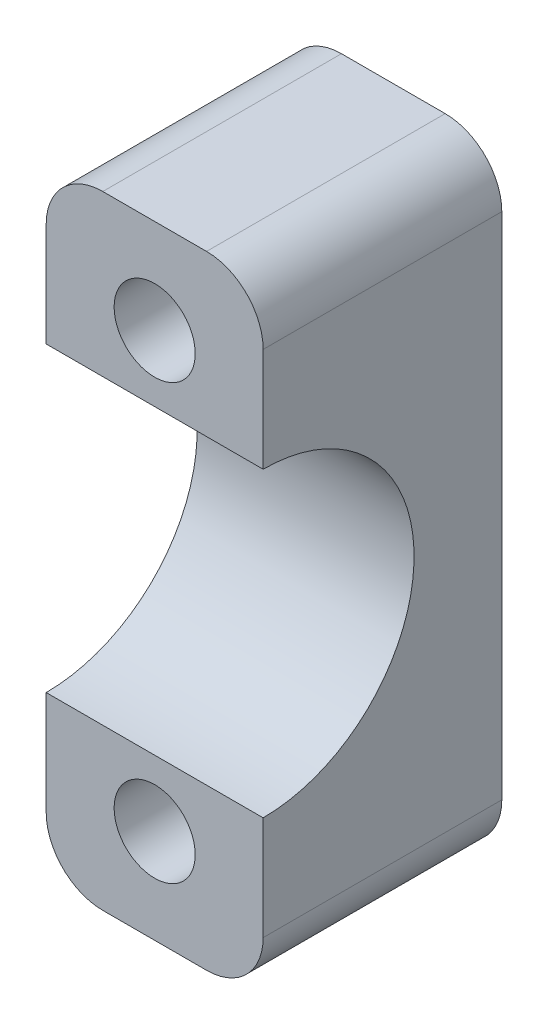
ISO-10303-21;
HEADER;
FILE_DESCRIPTION(('STEP AP214'),'2;1');
FILE_NAME('part.step','',(''),(''),'','','');
FILE_SCHEMA(('AUTOMOTIVE_DESIGN { 1 0 10303 214 1 1 1 1 }'));
ENDSEC;
DATA;
#1=APPLICATION_CONTEXT('core data for automotive mechanical design processes');
#2=APPLICATION_PROTOCOL_DEFINITION('international standard','automotive_design',2000,#1);
#3=PRODUCT_CONTEXT('',#1,'mechanical');
#4=PRODUCT('Part','Part','',(#3));
#5=PRODUCT_RELATED_PRODUCT_CATEGORY('part','',(#4));
#6=PRODUCT_DEFINITION_FORMATION('','',#4);
#7=PRODUCT_DEFINITION_CONTEXT('part definition',#1,'design');
#8=PRODUCT_DEFINITION('design','',#6,#7);
#9=PRODUCT_DEFINITION_SHAPE('','',#8);
#10=(LENGTH_UNIT() NAMED_UNIT(*) SI_UNIT(.MILLI.,.METRE.));
#11=(NAMED_UNIT(*) PLANE_ANGLE_UNIT() SI_UNIT($,.RADIAN.));
#12=(NAMED_UNIT(*) SI_UNIT($,.STERADIAN.) SOLID_ANGLE_UNIT());
#13=UNCERTAINTY_MEASURE_WITH_UNIT(LENGTH_MEASURE(1.E-05),#10,'distance_accuracy_value','');
#14=(GEOMETRIC_REPRESENTATION_CONTEXT(3) GLOBAL_UNCERTAINTY_ASSIGNED_CONTEXT((#13)) GLOBAL_UNIT_ASSIGNED_CONTEXT((#10,
#11,#12)) REPRESENTATION_CONTEXT('',''));
#15=CARTESIAN_POINT('',(0.,0.,0.));
#16=DIRECTION('',(0.,0.,1.));
#17=DIRECTION('',(1.,0.,0.));
#18=AXIS2_PLACEMENT_3D('',#15,#16,#17);
#19=CARTESIAN_POINT('',(0.,0.,12.65));
#20=DIRECTION('',(0.,0.,1.));
#21=DIRECTION('',(1.,0.,0.));
#22=AXIS2_PLACEMENT_3D('',#19,#20,#21);
#23=PLANE('',#22);
#24=CARTESIAN_POINT('',(0.,-11.5,12.65));
#25=DIRECTION('',(0.,0.,-1.));
#26=DIRECTION('',(-1.,0.,0.));
#27=AXIS2_PLACEMENT_3D('',#24,#25,#26);
#28=CIRCLE('',#27,2.15);
#29=CARTESIAN_POINT('',(-2.15,-11.5,12.65));
#30=VERTEX_POINT('',#29);
#31=EDGE_CURVE('E125',#30,#30,#28,.T.);
#32=ORIENTED_EDGE('',*,*,#31,.T.);
#33=EDGE_LOOP('',(#32));
#34=FACE_BOUND('',#33,.T.);
#35=DIRECTION('',(1.,0.,0.));
#36=VECTOR('',#35,1.);
#37=CARTESIAN_POINT('',(-5.751,-8.,12.65));
#38=LINE('',#37,#36);
#39=CARTESIAN_POINT('',(-5.75,-8.,12.65));
#40=VERTEX_POINT('',#39);
#41=CARTESIAN_POINT('',(5.75,-8.,12.65));
#42=VERTEX_POINT('',#41);
#43=EDGE_CURVE('E117',#40,#42,#38,.T.);
#44=ORIENTED_EDGE('',*,*,#43,.F.);
#45=DIRECTION('',(0.,-1.,0.));
#46=VECTOR('',#45,1.);
#47=CARTESIAN_POINT('',(-5.75,16.5,12.65));
#48=LINE('',#47,#46);
#49=CARTESIAN_POINT('',(-5.75,-13.5,12.65));
#50=VERTEX_POINT('',#49);
#51=EDGE_CURVE('E59',#40,#50,#48,.T.);
#52=ORIENTED_EDGE('',*,*,#51,.T.);
#53=CARTESIAN_POINT('',(-2.75,-13.5,12.65));
#54=DIRECTION('',(0.,0.,1.));
#55=DIRECTION('',(1.,0.,0.));
#56=AXIS2_PLACEMENT_3D('',#53,#54,#55);
#57=CIRCLE('',#56,3.);
#58=CARTESIAN_POINT('',(-2.75,-16.5,12.65));
#59=VERTEX_POINT('',#58);
#60=EDGE_CURVE('E174',#50,#59,#57,.T.);
#61=ORIENTED_EDGE('',*,*,#60,.T.);
#62=DIRECTION('',(1.,0.,0.));
#63=VECTOR('',#62,1.);
#64=CARTESIAN_POINT('',(-5.75,-16.5,12.65));
#65=LINE('',#64,#63);
#66=CARTESIAN_POINT('',(2.75,-16.5,12.65));
#67=VERTEX_POINT('',#66);
#68=EDGE_CURVE('E131',#59,#67,#65,.T.);
#69=ORIENTED_EDGE('',*,*,#68,.T.);
#70=CARTESIAN_POINT('',(2.75,-13.5,12.65));
#71=DIRECTION('',(0.,0.,1.));
#72=DIRECTION('',(1.,0.,0.));
#73=AXIS2_PLACEMENT_3D('',#70,#71,#72);
#74=CIRCLE('',#73,3.);
#75=CARTESIAN_POINT('',(5.75,-13.5,12.65));
#76=VERTEX_POINT('',#75);
#77=EDGE_CURVE('E176',#67,#76,#74,.T.);
#78=ORIENTED_EDGE('',*,*,#77,.T.);
#79=DIRECTION('',(0.,1.,0.));
#80=VECTOR('',#79,1.);
#81=CARTESIAN_POINT('',(5.75,16.5,12.65));
#82=LINE('',#81,#80);
#83=EDGE_CURVE('E212',#76,#42,#82,.T.);
#84=ORIENTED_EDGE('',*,*,#83,.T.);
#85=EDGE_LOOP('',(#44,#52,#61,#69,#78,#84));
#86=FACE_BOUND('',#85,.T.);
#87=ADVANCED_FACE('F36',(#34,#86),#23,.T.);
#88=CARTESIAN_POINT('',(5.75,16.5,12.65));
#89=DIRECTION('',(-1.,0.,0.));
#90=DIRECTION('',(0.,-1.,0.));
#91=AXIS2_PLACEMENT_3D('',#88,#89,#90);
#92=PLANE('',#91);
#93=CARTESIAN_POINT('',(5.75,8.,12.65));
#94=VERTEX_POINT('',#93);
#95=CARTESIAN_POINT('',(5.75,13.5,12.65));
#96=VERTEX_POINT('',#95);
#97=EDGE_CURVE('E152',#94,#96,#82,.T.);
#98=ORIENTED_EDGE('',*,*,#97,.F.);
#99=CARTESIAN_POINT('',(5.75,0.,12.65));
#100=DIRECTION('',(1.,0.,0.));
#101=DIRECTION('',(0.,1.,0.));
#102=AXIS2_PLACEMENT_3D('',#99,#100,#101);
#103=CIRCLE('',#102,8.);
#104=EDGE_CURVE('E51',#42,#94,#103,.T.);
#105=ORIENTED_EDGE('',*,*,#104,.F.);
#106=ORIENTED_EDGE('',*,*,#83,.F.);
#107=DIRECTION('',(0.,0.,-1.));
#108=VECTOR('',#107,1.);
#109=CARTESIAN_POINT('',(5.75,-13.5,12.65));
#110=LINE('',#109,#108);
#111=CARTESIAN_POINT('',(5.75,-13.5,0.));
#112=VERTEX_POINT('',#111);
#113=EDGE_CURVE('E155',#76,#112,#110,.T.);
#114=ORIENTED_EDGE('',*,*,#113,.T.);
#115=DIRECTION('',(0.,1.,0.));
#116=VECTOR('',#115,1.);
#117=CARTESIAN_POINT('',(5.75,16.5,0.));
#118=LINE('',#117,#116);
#119=CARTESIAN_POINT('',(5.75,13.5,0.));
#120=VERTEX_POINT('',#119);
#121=EDGE_CURVE('E140',#112,#120,#118,.T.);
#122=ORIENTED_EDGE('',*,*,#121,.T.);
#123=DIRECTION('',(0.,0.,-1.));
#124=VECTOR('',#123,1.);
#125=CARTESIAN_POINT('',(5.75,13.5,12.65));
#126=LINE('',#125,#124);
#127=EDGE_CURVE('E134',#120,#96,#126,.F.);
#128=ORIENTED_EDGE('',*,*,#127,.T.);
#129=EDGE_LOOP('',(#98,#105,#106,#114,#122,#128));
#130=FACE_BOUND('',#129,.T.);
#131=ADVANCED_FACE('F214',(#130),#92,.F.);
#132=CARTESIAN_POINT('',(-5.75,16.5,12.65));
#133=DIRECTION('',(0.,-1.,0.));
#134=DIRECTION('',(0.,0.,-1.));
#135=AXIS2_PLACEMENT_3D('',#132,#133,#134);
#136=PLANE('',#135);
#137=DIRECTION('',(-1.,0.,0.));
#138=VECTOR('',#137,1.);
#139=CARTESIAN_POINT('',(-5.75,16.5,0.));
#140=LINE('',#139,#138);
#141=CARTESIAN_POINT('',(2.75,16.5,0.));
#142=VERTEX_POINT('',#141);
#143=CARTESIAN_POINT('',(-2.75,16.5,0.));
#144=VERTEX_POINT('',#143);
#145=EDGE_CURVE('E143',#142,#144,#140,.T.);
#146=ORIENTED_EDGE('',*,*,#145,.T.);
#147=DIRECTION('',(0.,0.,-1.));
#148=VECTOR('',#147,1.);
#149=CARTESIAN_POINT('',(-2.75,16.5,12.65));
#150=LINE('',#149,#148);
#151=CARTESIAN_POINT('',(-2.75,16.5,12.65));
#152=VERTEX_POINT('',#151);
#153=EDGE_CURVE('E11',#144,#152,#150,.F.);
#154=ORIENTED_EDGE('',*,*,#153,.T.);
#155=DIRECTION('',(-1.,0.,0.));
#156=VECTOR('',#155,1.);
#157=CARTESIAN_POINT('',(-5.75,16.5,12.65));
#158=LINE('',#157,#156);
#159=CARTESIAN_POINT('',(2.75,16.5,12.65));
#160=VERTEX_POINT('',#159);
#161=EDGE_CURVE('E136',#160,#152,#158,.T.);
#162=ORIENTED_EDGE('',*,*,#161,.F.);
#163=DIRECTION('',(0.,0.,-1.));
#164=VECTOR('',#163,1.);
#165=CARTESIAN_POINT('',(2.75,16.5,12.65));
#166=LINE('',#165,#164);
#167=EDGE_CURVE('E44',#160,#142,#166,.T.);
#168=ORIENTED_EDGE('',*,*,#167,.T.);
#169=EDGE_LOOP('',(#146,#154,#162,#168));
#170=FACE_BOUND('',#169,.T.);
#171=ADVANCED_FACE('F186',(#170),#136,.F.);
#172=CARTESIAN_POINT('',(-5.75,16.5,12.65));
#173=DIRECTION('',(1.,0.,0.));
#174=DIRECTION('',(0.,1.,0.));
#175=AXIS2_PLACEMENT_3D('',#172,#173,#174);
#176=PLANE('',#175);
#177=ORIENTED_EDGE('',*,*,#51,.F.);
#178=CARTESIAN_POINT('',(-5.75,0.,12.65));
#179=DIRECTION('',(1.,0.,0.));
#180=DIRECTION('',(0.,1.,0.));
#181=AXIS2_PLACEMENT_3D('',#178,#179,#180);
#182=CIRCLE('',#181,8.);
#183=CARTESIAN_POINT('',(-5.75,8.,12.65));
#184=VERTEX_POINT('',#183);
#185=EDGE_CURVE('E113',#184,#40,#182,.F.);
#186=ORIENTED_EDGE('',*,*,#185,.F.);
#187=CARTESIAN_POINT('',(-5.75,13.5,12.65));
#188=VERTEX_POINT('',#187);
#189=EDGE_CURVE('E123',#188,#184,#48,.T.);
#190=ORIENTED_EDGE('',*,*,#189,.F.);
#191=DIRECTION('',(0.,0.,-1.));
#192=VECTOR('',#191,1.);
#193=CARTESIAN_POINT('',(-5.75,13.5,12.65));
#194=LINE('',#193,#192);
#195=CARTESIAN_POINT('',(-5.75,13.5,0.));
#196=VERTEX_POINT('',#195);
#197=EDGE_CURVE('E178',#188,#196,#194,.T.);
#198=ORIENTED_EDGE('',*,*,#197,.T.);
#199=DIRECTION('',(0.,-1.,0.));
#200=VECTOR('',#199,1.);
#201=CARTESIAN_POINT('',(-5.75,16.5,0.));
#202=LINE('',#201,#200);
#203=CARTESIAN_POINT('',(-5.75,-13.5,0.));
#204=VERTEX_POINT('',#203);
#205=EDGE_CURVE('E146',#196,#204,#202,.T.);
#206=ORIENTED_EDGE('',*,*,#205,.T.);
#207=DIRECTION('',(0.,0.,-1.));
#208=VECTOR('',#207,1.);
#209=CARTESIAN_POINT('',(-5.75,-13.5,12.65));
#210=LINE('',#209,#208);
#211=EDGE_CURVE('E180',#204,#50,#210,.F.);
#212=ORIENTED_EDGE('',*,*,#211,.T.);
#213=EDGE_LOOP('',(#177,#186,#190,#198,#206,#212));
#214=FACE_BOUND('',#213,.T.);
#215=ADVANCED_FACE('F121',(#214),#176,.F.);
#216=CARTESIAN_POINT('',(-5.75,-16.5,12.65));
#217=DIRECTION('',(0.,1.,0.));
#218=DIRECTION('',(0.,0.,1.));
#219=AXIS2_PLACEMENT_3D('',#216,#217,#218);
#220=PLANE('',#219);
#221=DIRECTION('',(1.,0.,0.));
#222=VECTOR('',#221,1.);
#223=CARTESIAN_POINT('',(-5.75,-16.5,0.));
#224=LINE('',#223,#222);
#225=CARTESIAN_POINT('',(-2.75,-16.5,0.));
#226=VERTEX_POINT('',#225);
#227=CARTESIAN_POINT('',(2.75,-16.5,0.));
#228=VERTEX_POINT('',#227);
#229=EDGE_CURVE('E149',#226,#228,#224,.T.);
#230=ORIENTED_EDGE('',*,*,#229,.T.);
#231=DIRECTION('',(0.,0.,-1.));
#232=VECTOR('',#231,1.);
#233=CARTESIAN_POINT('',(2.75,-16.5,12.65));
#234=LINE('',#233,#232);
#235=EDGE_CURVE('E169',#228,#67,#234,.F.);
#236=ORIENTED_EDGE('',*,*,#235,.T.);
#237=ORIENTED_EDGE('',*,*,#68,.F.);
#238=DIRECTION('',(0.,0.,-1.));
#239=VECTOR('',#238,1.);
#240=CARTESIAN_POINT('',(-2.75,-16.5,12.65));
#241=LINE('',#240,#239);
#242=EDGE_CURVE('E166',#59,#226,#241,.T.);
#243=ORIENTED_EDGE('',*,*,#242,.T.);
#244=EDGE_LOOP('',(#230,#236,#237,#243));
#245=FACE_BOUND('',#244,.T.);
#246=ADVANCED_FACE('F204',(#245),#220,.F.);
#247=CARTESIAN_POINT('',(0.,11.5,12.65));
#248=DIRECTION('',(0.,0.,-1.));
#249=DIRECTION('',(-1.,0.,0.));
#250=AXIS2_PLACEMENT_3D('',#247,#248,#249);
#251=CIRCLE('',#250,2.15);
#252=CARTESIAN_POINT('',(-2.15,11.5,12.65));
#253=VERTEX_POINT('',#252);
#254=EDGE_CURVE('E229',#253,#253,#251,.T.);
#255=ORIENTED_EDGE('',*,*,#254,.T.);
#256=EDGE_LOOP('',(#255));
#257=FACE_BOUND('',#256,.T.);
#258=DIRECTION('',(1.,0.,0.));
#259=VECTOR('',#258,1.);
#260=CARTESIAN_POINT('',(-5.751,8.,12.65));
#261=LINE('',#260,#259);
#262=EDGE_CURVE('E110',#184,#94,#261,.T.);
#263=ORIENTED_EDGE('',*,*,#262,.T.);
#264=ORIENTED_EDGE('',*,*,#97,.T.);
#265=CARTESIAN_POINT('',(2.75,13.5,12.65));
#266=DIRECTION('',(0.,0.,1.));
#267=DIRECTION('',(1.,0.,0.));
#268=AXIS2_PLACEMENT_3D('',#265,#266,#267);
#269=CIRCLE('',#268,3.);
#270=EDGE_CURVE('E171',#96,#160,#269,.T.);
#271=ORIENTED_EDGE('',*,*,#270,.T.);
#272=ORIENTED_EDGE('',*,*,#161,.T.);
#273=CARTESIAN_POINT('',(-2.75,13.5,12.65));
#274=DIRECTION('',(0.,0.,1.));
#275=DIRECTION('',(1.,0.,0.));
#276=AXIS2_PLACEMENT_3D('',#273,#274,#275);
#277=CIRCLE('',#276,3.);
#278=EDGE_CURVE('E130',#152,#188,#277,.T.);
#279=ORIENTED_EDGE('',*,*,#278,.T.);
#280=ORIENTED_EDGE('',*,*,#189,.T.);
#281=EDGE_LOOP('',(#263,#264,#271,#272,#279,#280));
#282=FACE_BOUND('',#281,.T.);
#283=ADVANCED_FACE('F127',(#257,#282),#23,.T.);
#284=CARTESIAN_POINT('',(0.,0.,0.));
#285=DIRECTION('',(0.,0.,1.));
#286=DIRECTION('',(1.,0.,0.));
#287=AXIS2_PLACEMENT_3D('',#284,#285,#286);
#288=PLANE('',#287);
#289=CARTESIAN_POINT('',(0.,11.5,0.));
#290=DIRECTION('',(0.,0.,-1.));
#291=DIRECTION('',(-1.,0.,0.));
#292=AXIS2_PLACEMENT_3D('',#289,#290,#291);
#293=CIRCLE('',#292,4.);
#294=CARTESIAN_POINT('',(-4.,11.5,0.));
#295=VERTEX_POINT('',#294);
#296=EDGE_CURVE('E238',#295,#295,#293,.T.);
#297=ORIENTED_EDGE('',*,*,#296,.F.);
#298=EDGE_LOOP('',(#297));
#299=FACE_BOUND('',#298,.T.);
#300=CARTESIAN_POINT('',(0.,-11.5,0.));
#301=DIRECTION('',(0.,0.,-1.));
#302=DIRECTION('',(-1.,0.,0.));
#303=AXIS2_PLACEMENT_3D('',#300,#301,#302);
#304=CIRCLE('',#303,4.);
#305=CARTESIAN_POINT('',(-4.,-11.5,0.));
#306=VERTEX_POINT('',#305);
#307=EDGE_CURVE('E226',#306,#306,#304,.T.);
#308=ORIENTED_EDGE('',*,*,#307,.F.);
#309=EDGE_LOOP('',(#308));
#310=FACE_BOUND('',#309,.T.);
#311=ORIENTED_EDGE('',*,*,#121,.F.);
#312=CARTESIAN_POINT('',(2.75,-13.5,0.));
#313=DIRECTION('',(0.,0.,1.));
#314=DIRECTION('',(1.,0.,0.));
#315=AXIS2_PLACEMENT_3D('',#312,#313,#314);
#316=CIRCLE('',#315,3.);
#317=EDGE_CURVE('E164',#112,#228,#316,.F.);
#318=ORIENTED_EDGE('',*,*,#317,.T.);
#319=ORIENTED_EDGE('',*,*,#229,.F.);
#320=CARTESIAN_POINT('',(-2.75,-13.5,0.));
#321=DIRECTION('',(0.,0.,1.));
#322=DIRECTION('',(1.,0.,0.));
#323=AXIS2_PLACEMENT_3D('',#320,#321,#322);
#324=CIRCLE('',#323,3.);
#325=EDGE_CURVE('E162',#226,#204,#324,.F.);
#326=ORIENTED_EDGE('',*,*,#325,.T.);
#327=ORIENTED_EDGE('',*,*,#205,.F.);
#328=CARTESIAN_POINT('',(-2.75,13.5,0.));
#329=DIRECTION('',(0.,0.,1.));
#330=DIRECTION('',(1.,0.,0.));
#331=AXIS2_PLACEMENT_3D('',#328,#329,#330);
#332=CIRCLE('',#331,3.);
#333=EDGE_CURVE('E160',#196,#144,#332,.F.);
#334=ORIENTED_EDGE('',*,*,#333,.T.);
#335=ORIENTED_EDGE('',*,*,#145,.F.);
#336=CARTESIAN_POINT('',(2.75,13.5,0.));
#337=DIRECTION('',(0.,0.,1.));
#338=DIRECTION('',(1.,0.,0.));
#339=AXIS2_PLACEMENT_3D('',#336,#337,#338);
#340=CIRCLE('',#339,3.);
#341=EDGE_CURVE('E158',#142,#120,#340,.F.);
#342=ORIENTED_EDGE('',*,*,#341,.T.);
#343=EDGE_LOOP('',(#311,#318,#319,#326,#327,#334,#335,#342));
#344=FACE_BOUND('',#343,.T.);
#345=ADVANCED_FACE('F192',(#299,#310,#344),#288,.F.);
#346=CARTESIAN_POINT('',(2.75,-13.5,12.65));
#347=DIRECTION('',(0.,0.,-1.));
#348=DIRECTION('',(-1.,0.,0.));
#349=AXIS2_PLACEMENT_3D('',#346,#347,#348);
#350=CYLINDRICAL_SURFACE('',#349,3.);
#351=ORIENTED_EDGE('',*,*,#77,.F.);
#352=ORIENTED_EDGE('',*,*,#235,.F.);
#353=ORIENTED_EDGE('',*,*,#317,.F.);
#354=ORIENTED_EDGE('',*,*,#113,.F.);
#355=EDGE_LOOP('',(#351,#352,#353,#354));
#356=FACE_BOUND('',#355,.T.);
#357=ADVANCED_FACE('F208',(#356),#350,.T.);
#358=CARTESIAN_POINT('',(-2.75,-13.5,12.65));
#359=DIRECTION('',(0.,0.,-1.));
#360=DIRECTION('',(-1.,0.,0.));
#361=AXIS2_PLACEMENT_3D('',#358,#359,#360);
#362=CYLINDRICAL_SURFACE('',#361,3.);
#363=ORIENTED_EDGE('',*,*,#60,.F.);
#364=ORIENTED_EDGE('',*,*,#211,.F.);
#365=ORIENTED_EDGE('',*,*,#325,.F.);
#366=ORIENTED_EDGE('',*,*,#242,.F.);
#367=EDGE_LOOP('',(#363,#364,#365,#366));
#368=FACE_BOUND('',#367,.T.);
#369=ADVANCED_FACE('F199',(#368),#362,.T.);
#370=CARTESIAN_POINT('',(-2.75,13.5,12.65));
#371=DIRECTION('',(0.,0.,-1.));
#372=DIRECTION('',(-1.,0.,0.));
#373=AXIS2_PLACEMENT_3D('',#370,#371,#372);
#374=CYLINDRICAL_SURFACE('',#373,3.);
#375=ORIENTED_EDGE('',*,*,#278,.F.);
#376=ORIENTED_EDGE('',*,*,#153,.F.);
#377=ORIENTED_EDGE('',*,*,#333,.F.);
#378=ORIENTED_EDGE('',*,*,#197,.F.);
#379=EDGE_LOOP('',(#375,#376,#377,#378));
#380=FACE_BOUND('',#379,.T.);
#381=ADVANCED_FACE('F195',(#380),#374,.T.);
#382=CARTESIAN_POINT('',(2.75,13.5,12.65));
#383=DIRECTION('',(0.,0.,-1.));
#384=DIRECTION('',(-1.,0.,0.));
#385=AXIS2_PLACEMENT_3D('',#382,#383,#384);
#386=CYLINDRICAL_SURFACE('',#385,3.);
#387=ORIENTED_EDGE('',*,*,#270,.F.);
#388=ORIENTED_EDGE('',*,*,#127,.F.);
#389=ORIENTED_EDGE('',*,*,#341,.F.);
#390=ORIENTED_EDGE('',*,*,#167,.F.);
#391=EDGE_LOOP('',(#387,#388,#389,#390));
#392=FACE_BOUND('',#391,.T.);
#393=ADVANCED_FACE('F38',(#392),#386,.T.);
#394=CARTESIAN_POINT('',(-5.751,0.,12.65));
#395=DIRECTION('',(1.,0.,0.));
#396=DIRECTION('',(0.,1.,0.));
#397=AXIS2_PLACEMENT_3D('',#394,#395,#396);
#398=CYLINDRICAL_SURFACE('',#397,8.);
#399=ORIENTED_EDGE('',*,*,#185,.T.);
#400=ORIENTED_EDGE('',*,*,#43,.T.);
#401=ORIENTED_EDGE('',*,*,#104,.T.);
#402=ORIENTED_EDGE('',*,*,#262,.F.);
#403=EDGE_LOOP('',(#399,#400,#401,#402));
#404=FACE_BOUND('',#403,.T.);
#405=ADVANCED_FACE('F112',(#404),#398,.F.);
#406=CARTESIAN_POINT('',(0.,-11.5,0.));
#407=DIRECTION('',(0.,0.,-1.));
#408=DIRECTION('',(-1.,0.,0.));
#409=AXIS2_PLACEMENT_3D('',#406,#407,#408);
#410=CYLINDRICAL_SURFACE('',#409,2.15);
#411=ORIENTED_EDGE('',*,*,#31,.F.);
#412=EDGE_LOOP('',(#411));
#413=FACE_BOUND('',#412,.T.);
#414=CARTESIAN_POINT('',(0.,-11.5,4.));
#415=DIRECTION('',(0.,0.,-1.));
#416=DIRECTION('',(-1.,0.,0.));
#417=AXIS2_PLACEMENT_3D('',#414,#415,#416);
#418=CIRCLE('',#417,2.15);
#419=CARTESIAN_POINT('',(-2.15,-11.5,4.));
#420=VERTEX_POINT('',#419);
#421=EDGE_CURVE('E220',#420,#420,#418,.T.);
#422=ORIENTED_EDGE('',*,*,#421,.T.);
#423=EDGE_LOOP('',(#422));
#424=FACE_BOUND('',#423,.T.);
#425=ADVANCED_FACE('F262',(#413,#424),#410,.F.);
#426=CARTESIAN_POINT('',(2.15,-11.5,4.));
#427=DIRECTION('',(0.,0.,1.));
#428=DIRECTION('',(1.,0.,0.));
#429=AXIS2_PLACEMENT_3D('',#426,#427,#428);
#430=PLANE('',#429);
#431=ORIENTED_EDGE('',*,*,#421,.F.);
#432=EDGE_LOOP('',(#431));
#433=FACE_BOUND('',#432,.T.);
#434=CARTESIAN_POINT('',(0.,-11.5,4.));
#435=DIRECTION('',(0.,0.,-1.));
#436=DIRECTION('',(-1.,0.,0.));
#437=AXIS2_PLACEMENT_3D('',#434,#435,#436);
#438=CIRCLE('',#437,4.);
#439=CARTESIAN_POINT('',(-4.,-11.5,4.));
#440=VERTEX_POINT('',#439);
#441=EDGE_CURVE('E223',#440,#440,#438,.T.);
#442=ORIENTED_EDGE('',*,*,#441,.T.);
#443=EDGE_LOOP('',(#442));
#444=FACE_BOUND('',#443,.T.);
#445=ADVANCED_FACE('F252',(#433,#444),#430,.F.);
#446=CARTESIAN_POINT('',(0.,-11.5,0.));
#447=DIRECTION('',(0.,0.,-1.));
#448=DIRECTION('',(-1.,0.,0.));
#449=AXIS2_PLACEMENT_3D('',#446,#447,#448);
#450=CYLINDRICAL_SURFACE('',#449,4.);
#451=ORIENTED_EDGE('',*,*,#441,.F.);
#452=EDGE_LOOP('',(#451));
#453=FACE_BOUND('',#452,.T.);
#454=ORIENTED_EDGE('',*,*,#307,.T.);
#455=EDGE_LOOP('',(#454));
#456=FACE_BOUND('',#455,.T.);
#457=ADVANCED_FACE('F249',(#453,#456),#450,.F.);
#458=CARTESIAN_POINT('',(0.,11.5,0.));
#459=DIRECTION('',(0.,0.,-1.));
#460=DIRECTION('',(-1.,0.,0.));
#461=AXIS2_PLACEMENT_3D('',#458,#459,#460);
#462=CYLINDRICAL_SURFACE('',#461,2.15);
#463=ORIENTED_EDGE('',*,*,#254,.F.);
#464=EDGE_LOOP('',(#463));
#465=FACE_BOUND('',#464,.T.);
#466=CARTESIAN_POINT('',(0.,11.5,4.));
#467=DIRECTION('',(0.,0.,-1.));
#468=DIRECTION('',(-1.,0.,0.));
#469=AXIS2_PLACEMENT_3D('',#466,#467,#468);
#470=CIRCLE('',#469,2.15);
#471=CARTESIAN_POINT('',(-2.15,11.5,4.));
#472=VERTEX_POINT('',#471);
#473=EDGE_CURVE('E232',#472,#472,#470,.T.);
#474=ORIENTED_EDGE('',*,*,#473,.T.);
#475=EDGE_LOOP('',(#474));
#476=FACE_BOUND('',#475,.T.);
#477=ADVANCED_FACE('F251',(#465,#476),#462,.F.);
#478=CARTESIAN_POINT('',(2.15,11.5,4.));
#479=DIRECTION('',(0.,0.,1.));
#480=DIRECTION('',(1.,0.,0.));
#481=AXIS2_PLACEMENT_3D('',#478,#479,#480);
#482=PLANE('',#481);
#483=ORIENTED_EDGE('',*,*,#473,.F.);
#484=EDGE_LOOP('',(#483));
#485=FACE_BOUND('',#484,.T.);
#486=CARTESIAN_POINT('',(0.,11.5,4.));
#487=DIRECTION('',(0.,0.,-1.));
#488=DIRECTION('',(-1.,0.,0.));
#489=AXIS2_PLACEMENT_3D('',#486,#487,#488);
#490=CIRCLE('',#489,4.);
#491=CARTESIAN_POINT('',(-4.,11.5,4.));
#492=VERTEX_POINT('',#491);
#493=EDGE_CURVE('E235',#492,#492,#490,.T.);
#494=ORIENTED_EDGE('',*,*,#493,.T.);
#495=EDGE_LOOP('',(#494));
#496=FACE_BOUND('',#495,.T.);
#497=ADVANCED_FACE('F259',(#485,#496),#482,.F.);
#498=CARTESIAN_POINT('',(0.,11.5,0.));
#499=DIRECTION('',(0.,0.,-1.));
#500=DIRECTION('',(-1.,0.,0.));
#501=AXIS2_PLACEMENT_3D('',#498,#499,#500);
#502=CYLINDRICAL_SURFACE('',#501,4.);
#503=ORIENTED_EDGE('',*,*,#493,.F.);
#504=EDGE_LOOP('',(#503));
#505=FACE_BOUND('',#504,.T.);
#506=ORIENTED_EDGE('',*,*,#296,.T.);
#507=EDGE_LOOP('',(#506));
#508=FACE_BOUND('',#507,.T.);
#509=ADVANCED_FACE('F242',(#505,#508),#502,.F.);
#510=CLOSED_SHELL('',(#87,#131,#171,#215,#246,#283,#345,#357,#369,#381,#393,#405,#425,#445,#457,
#477,#497,#509));
#511=MANIFOLD_SOLID_BREP('B2',#510);
#512=ADVANCED_BREP_SHAPE_REPRESENTATION('',(#18,#511),#14);
#513=SHAPE_DEFINITION_REPRESENTATION(#9,#512);
ENDSEC;
END-ISO-10303-21;
